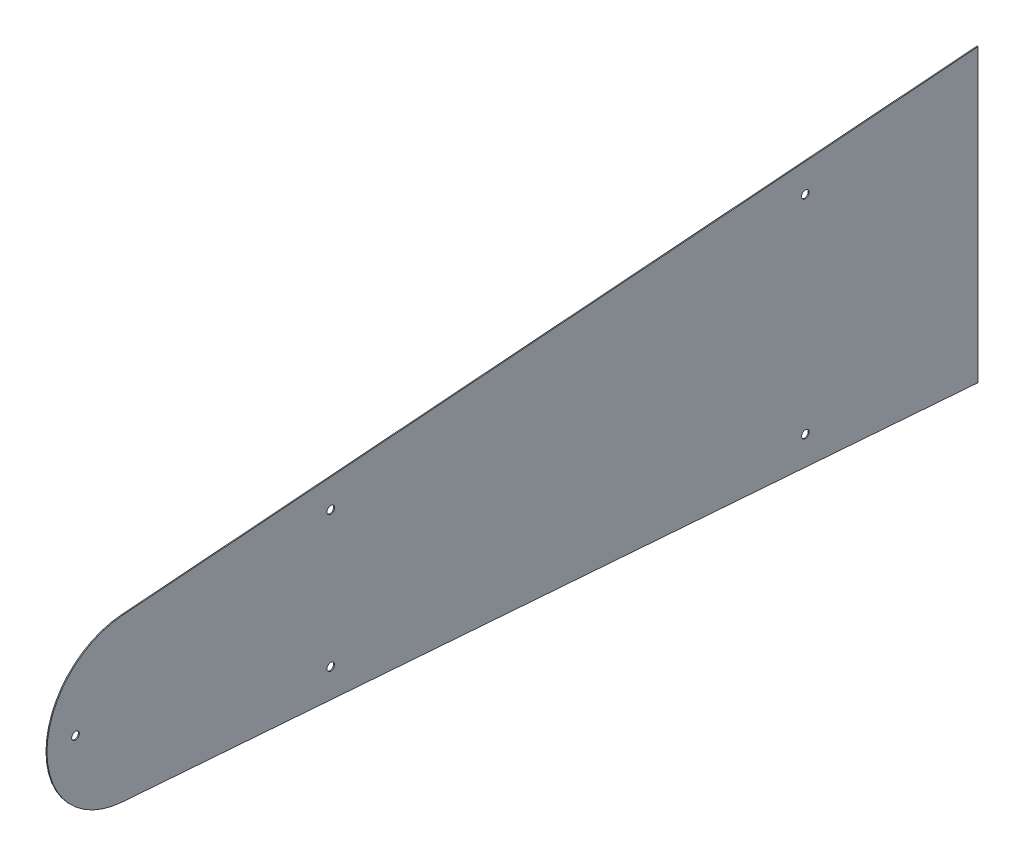
ISO-10303-21;
HEADER;
FILE_DESCRIPTION(('STEP AP214'),'2;1');
FILE_NAME('part.step','',(''),(''),'','','');
FILE_SCHEMA(('AUTOMOTIVE_DESIGN { 1 0 10303 214 1 1 1 1 }'));
ENDSEC;
DATA;
#1=APPLICATION_CONTEXT('core data for automotive mechanical design processes');
#2=APPLICATION_PROTOCOL_DEFINITION('international standard','automotive_design',2000,#1);
#3=PRODUCT_CONTEXT('',#1,'mechanical');
#4=PRODUCT('Part','Part','',(#3));
#5=PRODUCT_RELATED_PRODUCT_CATEGORY('part','',(#4));
#6=PRODUCT_DEFINITION_FORMATION('','',#4);
#7=PRODUCT_DEFINITION_CONTEXT('part definition',#1,'design');
#8=PRODUCT_DEFINITION('design','',#6,#7);
#9=PRODUCT_DEFINITION_SHAPE('','',#8);
#10=(LENGTH_UNIT() NAMED_UNIT(*) SI_UNIT(.MILLI.,.METRE.));
#11=(NAMED_UNIT(*) PLANE_ANGLE_UNIT() SI_UNIT($,.RADIAN.));
#12=(NAMED_UNIT(*) SI_UNIT($,.STERADIAN.) SOLID_ANGLE_UNIT());
#13=UNCERTAINTY_MEASURE_WITH_UNIT(LENGTH_MEASURE(1.E-05),#10,'distance_accuracy_value','');
#14=(GEOMETRIC_REPRESENTATION_CONTEXT(3) GLOBAL_UNCERTAINTY_ASSIGNED_CONTEXT((#13)) GLOBAL_UNIT_ASSIGNED_CONTEXT((#10,
#11,#12)) REPRESENTATION_CONTEXT('',''));
#15=CARTESIAN_POINT('',(0.,0.,0.));
#16=DIRECTION('',(0.,0.,1.));
#17=DIRECTION('',(1.,0.,0.));
#18=AXIS2_PLACEMENT_3D('',#15,#16,#17);
#19=CARTESIAN_POINT('',(0.5,0.,908.84));
#20=DIRECTION('',(1.,0.,0.));
#21=DIRECTION('',(0.,0.,-1.));
#22=AXIS2_PLACEMENT_3D('',#19,#20,#21);
#23=PLANE('',#22);
#24=CARTESIAN_POINT('',(0.5,-109.079602796342,197.213409476524));
#25=DIRECTION('',(1.,0.,0.));
#26=DIRECTION('',(0.,0.,-1.));
#27=AXIS2_PLACEMENT_3D('',#24,#25,#26);
#28=CIRCLE('',#27,3.99999999999999);
#29=CARTESIAN_POINT('',(0.5,-109.079602796342,193.213409476524));
#30=VERTEX_POINT('',#29);
#31=EDGE_CURVE('E118',#30,#30,#28,.F.);
#32=ORIENTED_EDGE('',*,*,#31,.T.);
#33=EDGE_LOOP('',(#32));
#34=FACE_BOUND('',#33,.T.);
#35=CARTESIAN_POINT('',(0.5,-71.3744293856482,695.789702432848));
#36=DIRECTION('',(1.,0.,0.));
#37=DIRECTION('',(0.,0.,-1.));
#38=AXIS2_PLACEMENT_3D('',#35,#36,#37);
#39=CIRCLE('',#38,4.00000000000001);
#40=CARTESIAN_POINT('',(0.5,-71.3744293856482,691.789702432848));
#41=VERTEX_POINT('',#40);
#42=EDGE_CURVE('E151',#41,#41,#39,.F.);
#43=ORIENTED_EDGE('',*,*,#42,.T.);
#44=EDGE_LOOP('',(#43));
#45=FACE_BOUND('',#44,.T.);
#46=CARTESIAN_POINT('',(0.5,0.,908.84));
#47=DIRECTION('',(1.,0.,0.));
#48=DIRECTION('',(0.,0.,-1.));
#49=AXIS2_PLACEMENT_3D('',#46,#47,#48);
#50=CIRCLE('',#49,85.105);
#51=CARTESIAN_POINT('',(0.5,84.8626708240958,915.257797566234));
#52=VERTEX_POINT('',#51);
#53=CARTESIAN_POINT('',(0.5,-84.8626708240958,915.257797566234));
#54=VERTEX_POINT('',#53);
#55=EDGE_CURVE('E98',#52,#54,#50,.T.);
#56=ORIENTED_EDGE('',*,*,#55,.T.);
#57=DIRECTION('',(0.,-0.0754103468213876,-0.997152585912647));
#58=VECTOR('',#57,1.);
#59=CARTESIAN_POINT('',(0.5,-152.87911048221,15.875));
#60=LINE('',#59,#58);
#61=CARTESIAN_POINT('',(0.5,-152.87911048221,15.875));
#62=VERTEX_POINT('',#61);
#63=EDGE_CURVE('E93',#54,#62,#60,.T.);
#64=ORIENTED_EDGE('',*,*,#63,.T.);
#65=DIRECTION('',(0.,1.,0.));
#66=VECTOR('',#65,1.);
#67=CARTESIAN_POINT('',(0.5,-152.87911048221,15.875));
#68=LINE('',#67,#66);
#69=CARTESIAN_POINT('',(0.5,152.87911048221,15.875));
#70=VERTEX_POINT('',#69);
#71=EDGE_CURVE('E96',#62,#70,#68,.T.);
#72=ORIENTED_EDGE('',*,*,#71,.T.);
#73=DIRECTION('',(0.,-0.0754103468213876,0.997152585912647));
#74=VECTOR('',#73,1.);
#75=CARTESIAN_POINT('',(0.5,152.87911048221,15.875));
#76=LINE('',#75,#74);
#77=EDGE_CURVE('E63',#70,#52,#76,.T.);
#78=ORIENTED_EDGE('',*,*,#77,.T.);
#79=EDGE_LOOP('',(#56,#64,#72,#78));
#80=FACE_BOUND('',#79,.T.);
#81=CARTESIAN_POINT('',(0.5,0.,963.945));
#82=DIRECTION('',(1.,0.,0.));
#83=DIRECTION('',(0.,0.,-1.));
#84=AXIS2_PLACEMENT_3D('',#81,#82,#83);
#85=CIRCLE('',#84,4.);
#86=CARTESIAN_POINT('',(0.5,0.,959.945));
#87=VERTEX_POINT('',#86);
#88=EDGE_CURVE('E147',#87,#87,#85,.T.);
#89=ORIENTED_EDGE('',*,*,#88,.F.);
#90=EDGE_LOOP('',(#89));
#91=FACE_BOUND('',#90,.T.);
#92=CARTESIAN_POINT('',(0.5,71.3744293856484,695.789702432848));
#93=DIRECTION('',(1.,0.,0.));
#94=DIRECTION('',(0.,0.,-1.));
#95=AXIS2_PLACEMENT_3D('',#92,#93,#94);
#96=CIRCLE('',#95,4.00000000000002);
#97=CARTESIAN_POINT('',(0.5,71.3744293856484,691.789702432848));
#98=VERTEX_POINT('',#97);
#99=EDGE_CURVE('E143',#98,#98,#96,.T.);
#100=ORIENTED_EDGE('',*,*,#99,.F.);
#101=EDGE_LOOP('',(#100));
#102=FACE_BOUND('',#101,.T.);
#103=CARTESIAN_POINT('',(0.5,109.079602796342,197.213409476524));
#104=DIRECTION('',(1.,0.,0.));
#105=DIRECTION('',(0.,0.,-1.));
#106=AXIS2_PLACEMENT_3D('',#103,#104,#105);
#107=CIRCLE('',#106,3.99999999999999);
#108=CARTESIAN_POINT('',(0.5,109.079602796342,193.213409476524));
#109=VERTEX_POINT('',#108);
#110=EDGE_CURVE('E139',#109,#109,#107,.T.);
#111=ORIENTED_EDGE('',*,*,#110,.F.);
#112=EDGE_LOOP('',(#111));
#113=FACE_BOUND('',#112,.T.);
#114=ADVANCED_FACE('F45',(#34,#45,#80,#91,#102,#113),#23,.T.);
#115=CARTESIAN_POINT('',(-0.5,0.,908.84));
#116=DIRECTION('',(1.,0.,0.));
#117=DIRECTION('',(0.,0.,-1.));
#118=AXIS2_PLACEMENT_3D('',#115,#116,#117);
#119=PLANE('',#118);
#120=CARTESIAN_POINT('',(-0.5,-109.079602796342,197.213409476524));
#121=DIRECTION('',(-1.,0.,0.));
#122=DIRECTION('',(0.,0.,1.));
#123=AXIS2_PLACEMENT_3D('',#120,#121,#122);
#124=CIRCLE('',#123,3.99999999999999);
#125=CARTESIAN_POINT('',(-0.5,-109.079602796342,201.213409476524));
#126=VERTEX_POINT('',#125);
#127=EDGE_CURVE('E160',#126,#126,#124,.T.);
#128=ORIENTED_EDGE('',*,*,#127,.F.);
#129=EDGE_LOOP('',(#128));
#130=FACE_BOUND('',#129,.T.);
#131=CARTESIAN_POINT('',(-0.5,71.3744293856484,695.789702432848));
#132=DIRECTION('',(1.,0.,0.));
#133=DIRECTION('',(0.,0.,-1.));
#134=AXIS2_PLACEMENT_3D('',#131,#132,#133);
#135=CIRCLE('',#134,4.00000000000002);
#136=CARTESIAN_POINT('',(-0.5,71.3744293856484,691.789702432848));
#137=VERTEX_POINT('',#136);
#138=EDGE_CURVE('E168',#137,#137,#135,.T.);
#139=ORIENTED_EDGE('',*,*,#138,.T.);
#140=EDGE_LOOP('',(#139));
#141=FACE_BOUND('',#140,.T.);
#142=CARTESIAN_POINT('',(-0.5,0.,908.84));
#143=DIRECTION('',(1.,0.,0.));
#144=DIRECTION('',(0.,0.,-1.));
#145=AXIS2_PLACEMENT_3D('',#142,#143,#144);
#146=CIRCLE('',#145,85.105);
#147=CARTESIAN_POINT('',(-0.5,84.8626708240958,915.257797566234));
#148=VERTEX_POINT('',#147);
#149=CARTESIAN_POINT('',(-0.5,-84.8626708240958,915.257797566234));
#150=VERTEX_POINT('',#149);
#151=EDGE_CURVE('E114',#148,#150,#146,.T.);
#152=ORIENTED_EDGE('',*,*,#151,.F.);
#153=DIRECTION('',(0.,-0.0754103468213876,0.997152585912647));
#154=VECTOR('',#153,1.);
#155=CARTESIAN_POINT('',(-0.5,152.87911048221,15.875));
#156=LINE('',#155,#154);
#157=CARTESIAN_POINT('',(-0.5,152.87911048221,15.875));
#158=VERTEX_POINT('',#157);
#159=EDGE_CURVE('E86',#158,#148,#156,.T.);
#160=ORIENTED_EDGE('',*,*,#159,.F.);
#161=DIRECTION('',(0.,1.,0.));
#162=VECTOR('',#161,1.);
#163=CARTESIAN_POINT('',(-0.5,-152.87911048221,15.875));
#164=LINE('',#163,#162);
#165=CARTESIAN_POINT('',(-0.5,-152.87911048221,15.875));
#166=VERTEX_POINT('',#165);
#167=EDGE_CURVE('E80',#166,#158,#164,.T.);
#168=ORIENTED_EDGE('',*,*,#167,.F.);
#169=DIRECTION('',(0.,-0.0754103468213876,-0.997152585912647));
#170=VECTOR('',#169,1.);
#171=CARTESIAN_POINT('',(-0.5,-152.87911048221,15.875));
#172=LINE('',#171,#170);
#173=EDGE_CURVE('E103',#150,#166,#172,.T.);
#174=ORIENTED_EDGE('',*,*,#173,.F.);
#175=EDGE_LOOP('',(#152,#160,#168,#174));
#176=FACE_BOUND('',#175,.T.);
#177=CARTESIAN_POINT('',(-0.5,-71.3744293856482,695.789702432848));
#178=DIRECTION('',(-1.,0.,0.));
#179=DIRECTION('',(0.,0.,1.));
#180=AXIS2_PLACEMENT_3D('',#177,#178,#179);
#181=CIRCLE('',#180,4.00000000000001);
#182=CARTESIAN_POINT('',(-0.5,-71.3744293856482,699.789702432848));
#183=VERTEX_POINT('',#182);
#184=EDGE_CURVE('E155',#183,#183,#181,.T.);
#185=ORIENTED_EDGE('',*,*,#184,.F.);
#186=EDGE_LOOP('',(#185));
#187=FACE_BOUND('',#186,.T.);
#188=CARTESIAN_POINT('',(-0.5,0.,963.945));
#189=DIRECTION('',(1.,0.,0.));
#190=DIRECTION('',(0.,0.,-1.));
#191=AXIS2_PLACEMENT_3D('',#188,#189,#190);
#192=CIRCLE('',#191,4.);
#193=CARTESIAN_POINT('',(-0.5,0.,959.945));
#194=VERTEX_POINT('',#193);
#195=EDGE_CURVE('E159',#194,#194,#192,.T.);
#196=ORIENTED_EDGE('',*,*,#195,.T.);
#197=EDGE_LOOP('',(#196));
#198=FACE_BOUND('',#197,.T.);
#199=CARTESIAN_POINT('',(-0.5,109.079602796342,197.213409476524));
#200=DIRECTION('',(1.,0.,0.));
#201=DIRECTION('',(0.,0.,-1.));
#202=AXIS2_PLACEMENT_3D('',#199,#200,#201);
#203=CIRCLE('',#202,3.99999999999999);
#204=CARTESIAN_POINT('',(-0.5,109.079602796342,193.213409476524));
#205=VERTEX_POINT('',#204);
#206=EDGE_CURVE('E164',#205,#205,#203,.T.);
#207=ORIENTED_EDGE('',*,*,#206,.T.);
#208=EDGE_LOOP('',(#207));
#209=FACE_BOUND('',#208,.T.);
#210=ADVANCED_FACE('F131',(#130,#141,#176,#187,#198,#209),#119,.F.);
#211=CARTESIAN_POINT('',(0.5,0.,908.84));
#212=DIRECTION('',(-1.,0.,0.));
#213=DIRECTION('',(0.,0.,1.));
#214=AXIS2_PLACEMENT_3D('',#211,#212,#213);
#215=CYLINDRICAL_SURFACE('',#214,85.105);
#216=ORIENTED_EDGE('',*,*,#151,.T.);
#217=DIRECTION('',(-1.,0.,0.));
#218=VECTOR('',#217,1.);
#219=CARTESIAN_POINT('',(0.5,-84.8626708240958,915.257797566234));
#220=LINE('',#219,#218);
#221=EDGE_CURVE('E11',#54,#150,#220,.T.);
#222=ORIENTED_EDGE('',*,*,#221,.F.);
#223=ORIENTED_EDGE('',*,*,#55,.F.);
#224=DIRECTION('',(-1.,0.,0.));
#225=VECTOR('',#224,1.);
#226=CARTESIAN_POINT('',(0.5,84.8626708240958,915.257797566234));
#227=LINE('',#226,#225);
#228=EDGE_CURVE('E110',#52,#148,#227,.T.);
#229=ORIENTED_EDGE('',*,*,#228,.T.);
#230=EDGE_LOOP('',(#216,#222,#223,#229));
#231=FACE_BOUND('',#230,.T.);
#232=ADVANCED_FACE('F47',(#231),#215,.T.);
#233=CARTESIAN_POINT('',(0.5,-152.87911048221,15.875));
#234=DIRECTION('',(0.,0.997152585912647,-0.0754103468213876));
#235=DIRECTION('',(0.,0.0754103468213876,0.997152585912647));
#236=AXIS2_PLACEMENT_3D('',#233,#234,#235);
#237=PLANE('',#236);
#238=ORIENTED_EDGE('',*,*,#173,.T.);
#239=DIRECTION('',(-1.,0.,0.));
#240=VECTOR('',#239,1.);
#241=CARTESIAN_POINT('',(0.5,-152.87911048221,15.875));
#242=LINE('',#241,#240);
#243=EDGE_CURVE('E55',#62,#166,#242,.T.);
#244=ORIENTED_EDGE('',*,*,#243,.F.);
#245=ORIENTED_EDGE('',*,*,#63,.F.);
#246=ORIENTED_EDGE('',*,*,#221,.T.);
#247=EDGE_LOOP('',(#238,#244,#245,#246));
#248=FACE_BOUND('',#247,.T.);
#249=ADVANCED_FACE('F102',(#248),#237,.F.);
#250=CARTESIAN_POINT('',(0.5,-152.87911048221,15.875));
#251=DIRECTION('',(0.,0.,1.));
#252=DIRECTION('',(1.,0.,0.));
#253=AXIS2_PLACEMENT_3D('',#250,#251,#252);
#254=PLANE('',#253);
#255=ORIENTED_EDGE('',*,*,#167,.T.);
#256=DIRECTION('',(-1.,0.,0.));
#257=VECTOR('',#256,1.);
#258=CARTESIAN_POINT('',(0.5,152.87911048221,15.875));
#259=LINE('',#258,#257);
#260=EDGE_CURVE('E105',#70,#158,#259,.T.);
#261=ORIENTED_EDGE('',*,*,#260,.F.);
#262=ORIENTED_EDGE('',*,*,#71,.F.);
#263=ORIENTED_EDGE('',*,*,#243,.T.);
#264=EDGE_LOOP('',(#255,#261,#262,#263));
#265=FACE_BOUND('',#264,.T.);
#266=ADVANCED_FACE('F106',(#265),#254,.F.);
#267=CARTESIAN_POINT('',(0.5,152.87911048221,15.875));
#268=DIRECTION('',(0.,-0.997152585912647,-0.0754103468213876));
#269=DIRECTION('',(0.,0.0754103468213876,-0.997152585912647));
#270=AXIS2_PLACEMENT_3D('',#267,#268,#269);
#271=PLANE('',#270);
#272=ORIENTED_EDGE('',*,*,#159,.T.);
#273=ORIENTED_EDGE('',*,*,#228,.F.);
#274=ORIENTED_EDGE('',*,*,#77,.F.);
#275=ORIENTED_EDGE('',*,*,#260,.T.);
#276=EDGE_LOOP('',(#272,#273,#274,#275));
#277=FACE_BOUND('',#276,.T.);
#278=ADVANCED_FACE('F128',(#277),#271,.F.);
#279=CARTESIAN_POINT('',(-0.5,-71.3744293856482,695.789702432848));
#280=DIRECTION('',(1.,0.,0.));
#281=DIRECTION('',(0.,0.,-1.));
#282=AXIS2_PLACEMENT_3D('',#279,#280,#281);
#283=CYLINDRICAL_SURFACE('',#282,4.00000000000001);
#284=ORIENTED_EDGE('',*,*,#42,.F.);
#285=EDGE_LOOP('',(#284));
#286=FACE_BOUND('',#285,.T.);
#287=ORIENTED_EDGE('',*,*,#184,.T.);
#288=EDGE_LOOP('',(#287));
#289=FACE_BOUND('',#288,.T.);
#290=ADVANCED_FACE('F181',(#286,#289),#283,.F.);
#291=CARTESIAN_POINT('',(-0.5,0.,963.945));
#292=DIRECTION('',(1.,0.,0.));
#293=DIRECTION('',(0.,0.,-1.));
#294=AXIS2_PLACEMENT_3D('',#291,#292,#293);
#295=CYLINDRICAL_SURFACE('',#294,4.);
#296=ORIENTED_EDGE('',*,*,#88,.T.);
#297=EDGE_LOOP('',(#296));
#298=FACE_BOUND('',#297,.T.);
#299=ORIENTED_EDGE('',*,*,#195,.F.);
#300=EDGE_LOOP('',(#299));
#301=FACE_BOUND('',#300,.T.);
#302=ADVANCED_FACE('F178',(#298,#301),#295,.F.);
#303=CARTESIAN_POINT('',(-0.5,71.3744293856484,695.789702432848));
#304=DIRECTION('',(1.,0.,0.));
#305=DIRECTION('',(0.,0.,-1.));
#306=AXIS2_PLACEMENT_3D('',#303,#304,#305);
#307=CYLINDRICAL_SURFACE('',#306,4.00000000000002);
#308=ORIENTED_EDGE('',*,*,#99,.T.);
#309=EDGE_LOOP('',(#308));
#310=FACE_BOUND('',#309,.T.);
#311=ORIENTED_EDGE('',*,*,#138,.F.);
#312=EDGE_LOOP('',(#311));
#313=FACE_BOUND('',#312,.T.);
#314=ADVANCED_FACE('F180',(#310,#313),#307,.F.);
#315=CARTESIAN_POINT('',(-0.5,109.079602796342,197.213409476524));
#316=DIRECTION('',(1.,0.,0.));
#317=DIRECTION('',(0.,0.,-1.));
#318=AXIS2_PLACEMENT_3D('',#315,#316,#317);
#319=CYLINDRICAL_SURFACE('',#318,3.99999999999999);
#320=ORIENTED_EDGE('',*,*,#110,.T.);
#321=EDGE_LOOP('',(#320));
#322=FACE_BOUND('',#321,.T.);
#323=ORIENTED_EDGE('',*,*,#206,.F.);
#324=EDGE_LOOP('',(#323));
#325=FACE_BOUND('',#324,.T.);
#326=ADVANCED_FACE('F188',(#322,#325),#319,.F.);
#327=CARTESIAN_POINT('',(-0.5,-109.079602796342,197.213409476524));
#328=DIRECTION('',(1.,0.,0.));
#329=DIRECTION('',(0.,0.,-1.));
#330=AXIS2_PLACEMENT_3D('',#327,#328,#329);
#331=CYLINDRICAL_SURFACE('',#330,3.99999999999999);
#332=ORIENTED_EDGE('',*,*,#31,.F.);
#333=EDGE_LOOP('',(#332));
#334=FACE_BOUND('',#333,.T.);
#335=ORIENTED_EDGE('',*,*,#127,.T.);
#336=EDGE_LOOP('',(#335));
#337=FACE_BOUND('',#336,.T.);
#338=ADVANCED_FACE('F264',(#334,#337),#331,.F.);
#339=CLOSED_SHELL('',(#114,#210,#232,#249,#266,#278,#290,#302,#314,#326,#338));
#340=MANIFOLD_SOLID_BREP('B2',#339);
#341=ADVANCED_BREP_SHAPE_REPRESENTATION('',(#18,#340),#14);
#342=SHAPE_DEFINITION_REPRESENTATION(#9,#341);
ENDSEC;
END-ISO-10303-21;
